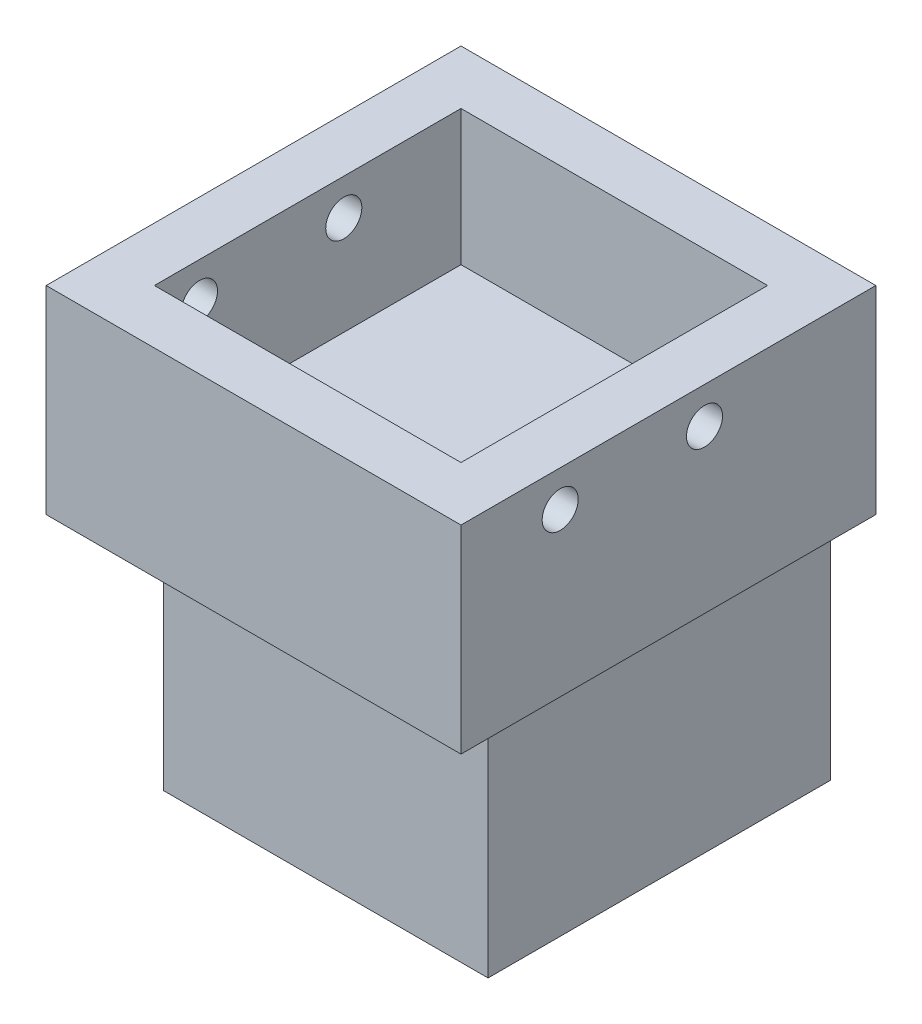
ISO-10303-21;
HEADER;
FILE_DESCRIPTION(('STEP AP214'),'2;1');
FILE_NAME('part.step','',(''),(''),'','','');
FILE_SCHEMA(('AUTOMOTIVE_DESIGN { 1 0 10303 214 1 1 1 1 }'));
ENDSEC;
DATA;
#1=APPLICATION_CONTEXT('core data for automotive mechanical design processes');
#2=APPLICATION_PROTOCOL_DEFINITION('international standard','automotive_design',2000,#1);
#3=PRODUCT_CONTEXT('',#1,'mechanical');
#4=PRODUCT('Part','Part','',(#3));
#5=PRODUCT_RELATED_PRODUCT_CATEGORY('part','',(#4));
#6=PRODUCT_DEFINITION_FORMATION('','',#4);
#7=PRODUCT_DEFINITION_CONTEXT('part definition',#1,'design');
#8=PRODUCT_DEFINITION('design','',#6,#7);
#9=PRODUCT_DEFINITION_SHAPE('','',#8);
#10=(LENGTH_UNIT() NAMED_UNIT(*) SI_UNIT(.MILLI.,.METRE.));
#11=(NAMED_UNIT(*) PLANE_ANGLE_UNIT() SI_UNIT($,.RADIAN.));
#12=(NAMED_UNIT(*) SI_UNIT($,.STERADIAN.) SOLID_ANGLE_UNIT());
#13=UNCERTAINTY_MEASURE_WITH_UNIT(LENGTH_MEASURE(1.E-05),#10,'distance_accuracy_value','');
#14=(GEOMETRIC_REPRESENTATION_CONTEXT(3) GLOBAL_UNCERTAINTY_ASSIGNED_CONTEXT((#13)) GLOBAL_UNIT_ASSIGNED_CONTEXT((#10,
#11,#12)) REPRESENTATION_CONTEXT('',''));
#15=CARTESIAN_POINT('',(0.,0.,0.));
#16=DIRECTION('',(0.,0.,1.));
#17=DIRECTION('',(1.,0.,0.));
#18=AXIS2_PLACEMENT_3D('',#15,#16,#17);
#19=CARTESIAN_POINT('',(0.,-11.,0.));
#20=DIRECTION('',(0.,1.,0.));
#21=DIRECTION('',(0.,0.,1.));
#22=AXIS2_PLACEMENT_3D('',#19,#20,#21);
#23=PLANE('',#22);
#24=DIRECTION('',(0.,0.,-1.));
#25=VECTOR('',#24,1.);
#26=CARTESIAN_POINT('',(1.33174603174603,-11.,-0.901746031746032));
#27=LINE('',#26,#25);
#28=CARTESIAN_POINT('',(1.33174603174603,-11.,18.098253968254));
#29=VERTEX_POINT('',#28);
#30=CARTESIAN_POINT('',(1.33174603174603,-11.,-0.901746031746032));
#31=VERTEX_POINT('',#30);
#32=EDGE_CURVE('E50',#29,#31,#27,.T.);
#33=ORIENTED_EDGE('',*,*,#32,.F.);
#34=DIRECTION('',(-1.,0.,0.));
#35=VECTOR('',#34,1.);
#36=CARTESIAN_POINT('',(1.33174603174603,-11.,18.098253968254));
#37=LINE('',#36,#35);
#38=CARTESIAN_POINT('',(19.331746031746,-11.,18.098253968254));
#39=VERTEX_POINT('',#38);
#40=EDGE_CURVE('E142',#39,#29,#37,.T.);
#41=ORIENTED_EDGE('',*,*,#40,.F.);
#42=DIRECTION('',(0.,0.,1.));
#43=VECTOR('',#42,1.);
#44=CARTESIAN_POINT('',(19.331746031746,-11.,-0.901746031746032));
#45=LINE('',#44,#43);
#46=CARTESIAN_POINT('',(19.331746031746,-11.,-0.901746031746032));
#47=VERTEX_POINT('',#46);
#48=EDGE_CURVE('E238',#47,#39,#45,.T.);
#49=ORIENTED_EDGE('',*,*,#48,.F.);
#50=DIRECTION('',(-1.,0.,0.));
#51=VECTOR('',#50,1.);
#52=CARTESIAN_POINT('',(-1.16825396825397,-11.,-0.901746031746032));
#53=LINE('',#52,#51);
#54=CARTESIAN_POINT('',(21.831746031746,-11.,-0.901746031746032));
#55=VERTEX_POINT('',#54);
#56=EDGE_CURVE('E193',#55,#47,#53,.T.);
#57=ORIENTED_EDGE('',*,*,#56,.F.);
#58=DIRECTION('',(0.,0.,-1.));
#59=VECTOR('',#58,1.);
#60=CARTESIAN_POINT('',(21.831746031746,-11.,-0.901746031746032));
#61=LINE('',#60,#59);
#62=CARTESIAN_POINT('',(21.831746031746,-11.,22.098253968254));
#63=VERTEX_POINT('',#62);
#64=EDGE_CURVE('E190',#63,#55,#61,.T.);
#65=ORIENTED_EDGE('',*,*,#64,.F.);
#66=DIRECTION('',(1.,0.,0.));
#67=VECTOR('',#66,1.);
#68=CARTESIAN_POINT('',(-1.16825396825397,-11.,22.098253968254));
#69=LINE('',#68,#67);
#70=CARTESIAN_POINT('',(-1.16825396825397,-11.,22.098253968254));
#71=VERTEX_POINT('',#70);
#72=EDGE_CURVE('E186',#71,#63,#69,.T.);
#73=ORIENTED_EDGE('',*,*,#72,.F.);
#74=DIRECTION('',(0.,0.,1.));
#75=VECTOR('',#74,1.);
#76=CARTESIAN_POINT('',(-1.16825396825397,-11.,-0.901746031746032));
#77=LINE('',#76,#75);
#78=CARTESIAN_POINT('',(-1.16825396825397,-11.,-0.901746031746032));
#79=VERTEX_POINT('',#78);
#80=EDGE_CURVE('E183',#79,#71,#77,.T.);
#81=ORIENTED_EDGE('',*,*,#80,.F.);
#82=EDGE_CURVE('E55',#31,#79,#53,.T.);
#83=ORIENTED_EDGE('',*,*,#82,.F.);
#84=EDGE_LOOP('',(#33,#41,#49,#57,#65,#73,#81,#83));
#85=FACE_BOUND('',#84,.T.);
#86=ADVANCED_FACE('F33',(#85),#23,.F.);
#87=CARTESIAN_POINT('',(-1.16825396825397,-11.,-0.901746031746032));
#88=DIRECTION('',(-1.,0.,0.));
#89=DIRECTION('',(0.,0.,1.));
#90=AXIS2_PLACEMENT_3D('',#87,#88,#89);
#91=PLANE('',#90);
#92=CARTESIAN_POINT('',(-1.16825396825397,-2.00693582496217,8.59825396825396));
#93=DIRECTION('',(-1.,0.,0.));
#94=DIRECTION('',(0.,0.,1.));
#95=AXIS2_PLACEMENT_3D('',#92,#93,#94);
#96=CIRCLE('',#95,1.);
#97=CARTESIAN_POINT('',(-1.16825396825397,-2.00693582496217,9.59825396825396));
#98=VERTEX_POINT('',#97);
#99=EDGE_CURVE('E218',#98,#98,#96,.T.);
#100=ORIENTED_EDGE('',*,*,#99,.F.);
#101=EDGE_LOOP('',(#100));
#102=FACE_BOUND('',#101,.T.);
#103=CARTESIAN_POINT('',(-1.16825396825397,-2.00693582496217,16.598253968254));
#104=DIRECTION('',(-1.,0.,0.));
#105=DIRECTION('',(0.,0.,1.));
#106=AXIS2_PLACEMENT_3D('',#103,#104,#105);
#107=CIRCLE('',#106,1.);
#108=CARTESIAN_POINT('',(-1.16825396825397,-2.00693582496217,17.598253968254));
#109=VERTEX_POINT('',#108);
#110=EDGE_CURVE('E228',#109,#109,#107,.T.);
#111=ORIENTED_EDGE('',*,*,#110,.F.);
#112=EDGE_LOOP('',(#111));
#113=FACE_BOUND('',#112,.T.);
#114=DIRECTION('',(0.,0.,1.));
#115=VECTOR('',#114,1.);
#116=CARTESIAN_POINT('',(-1.16825396825397,0.,-0.901746031746032));
#117=LINE('',#116,#115);
#118=CARTESIAN_POINT('',(-1.16825396825397,0.,-0.901746031746032));
#119=VERTEX_POINT('',#118);
#120=CARTESIAN_POINT('',(-1.16825396825397,0.,22.098253968254));
#121=VERTEX_POINT('',#120);
#122=EDGE_CURVE('E176',#119,#121,#117,.T.);
#123=ORIENTED_EDGE('',*,*,#122,.F.);
#124=DIRECTION('',(0.,1.,0.));
#125=VECTOR('',#124,1.);
#126=CARTESIAN_POINT('',(-1.16825396825397,-11.,-0.901746031746032));
#127=LINE('',#126,#125);
#128=EDGE_CURVE('E11',#79,#119,#127,.T.);
#129=ORIENTED_EDGE('',*,*,#128,.F.);
#130=ORIENTED_EDGE('',*,*,#80,.T.);
#131=DIRECTION('',(0.,1.,0.));
#132=VECTOR('',#131,1.);
#133=CARTESIAN_POINT('',(-1.16825396825397,-11.,22.098253968254));
#134=LINE('',#133,#132);
#135=EDGE_CURVE('E195',#71,#121,#134,.T.);
#136=ORIENTED_EDGE('',*,*,#135,.T.);
#137=EDGE_LOOP('',(#123,#129,#130,#136));
#138=FACE_BOUND('',#137,.T.);
#139=ADVANCED_FACE('F35',(#102,#113,#138),#91,.T.);
#140=CARTESIAN_POINT('',(-1.16825396825397,-11.,-0.901746031746032));
#141=DIRECTION('',(0.,0.,-1.));
#142=DIRECTION('',(-1.,0.,0.));
#143=AXIS2_PLACEMENT_3D('',#140,#141,#142);
#144=PLANE('',#143);
#145=DIRECTION('',(-1.,0.,0.));
#146=VECTOR('',#145,1.);
#147=CARTESIAN_POINT('',(-1.16825396825397,0.,-0.901746031746032));
#148=LINE('',#147,#146);
#149=CARTESIAN_POINT('',(21.831746031746,0.,-0.901746031746032));
#150=VERTEX_POINT('',#149);
#151=EDGE_CURVE('E187',#150,#119,#148,.T.);
#152=ORIENTED_EDGE('',*,*,#151,.F.);
#153=DIRECTION('',(0.,1.,0.));
#154=VECTOR('',#153,1.);
#155=CARTESIAN_POINT('',(21.831746031746,-11.,-0.901746031746032));
#156=LINE('',#155,#154);
#157=EDGE_CURVE('E42',#55,#150,#156,.T.);
#158=ORIENTED_EDGE('',*,*,#157,.F.);
#159=ORIENTED_EDGE('',*,*,#56,.T.);
#160=DIRECTION('',(0.,1.,0.));
#161=VECTOR('',#160,1.);
#162=CARTESIAN_POINT('',(19.331746031746,-25.,-0.901746031746032));
#163=LINE('',#162,#161);
#164=CARTESIAN_POINT('',(19.331746031746,-25.,-0.901746031746032));
#165=VERTEX_POINT('',#164);
#166=EDGE_CURVE('E129',#165,#47,#163,.T.);
#167=ORIENTED_EDGE('',*,*,#166,.F.);
#168=DIRECTION('',(1.,0.,0.));
#169=VECTOR('',#168,1.);
#170=CARTESIAN_POINT('',(1.33174603174603,-25.,-0.901746031746032));
#171=LINE('',#170,#169);
#172=CARTESIAN_POINT('',(1.33174603174603,-25.,-0.901746031746032));
#173=VERTEX_POINT('',#172);
#174=EDGE_CURVE('E121',#173,#165,#171,.T.);
#175=ORIENTED_EDGE('',*,*,#174,.F.);
#176=DIRECTION('',(0.,1.,0.));
#177=VECTOR('',#176,1.);
#178=CARTESIAN_POINT('',(1.33174603174603,-25.,-0.901746031746032));
#179=LINE('',#178,#177);
#180=EDGE_CURVE('E126',#173,#31,#179,.T.);
#181=ORIENTED_EDGE('',*,*,#180,.T.);
#182=ORIENTED_EDGE('',*,*,#82,.T.);
#183=ORIENTED_EDGE('',*,*,#128,.T.);
#184=EDGE_LOOP('',(#152,#158,#159,#167,#175,#181,#182,#183));
#185=FACE_BOUND('',#184,.T.);
#186=ADVANCED_FACE('F124',(#185),#144,.T.);
#187=CARTESIAN_POINT('',(21.831746031746,-11.,-0.901746031746032));
#188=DIRECTION('',(1.,0.,0.));
#189=DIRECTION('',(0.,0.,-1.));
#190=AXIS2_PLACEMENT_3D('',#187,#188,#189);
#191=PLANE('',#190);
#192=CARTESIAN_POINT('',(21.831746031746,-2.00693582496217,8.59825396825396));
#193=DIRECTION('',(-1.,0.,0.));
#194=DIRECTION('',(0.,0.,1.));
#195=AXIS2_PLACEMENT_3D('',#192,#193,#194);
#196=CIRCLE('',#195,1.);
#197=CARTESIAN_POINT('',(21.831746031746,-2.00693582496217,9.59825396825396));
#198=VERTEX_POINT('',#197);
#199=EDGE_CURVE('E212',#198,#198,#196,.T.);
#200=ORIENTED_EDGE('',*,*,#199,.T.);
#201=EDGE_LOOP('',(#200));
#202=FACE_BOUND('',#201,.T.);
#203=CARTESIAN_POINT('',(21.831746031746,-2.00693582496217,16.598253968254));
#204=DIRECTION('',(-1.,0.,0.));
#205=DIRECTION('',(0.,0.,1.));
#206=AXIS2_PLACEMENT_3D('',#203,#204,#205);
#207=CIRCLE('',#206,1.);
#208=CARTESIAN_POINT('',(21.831746031746,-2.00693582496217,17.598253968254));
#209=VERTEX_POINT('',#208);
#210=EDGE_CURVE('E223',#209,#209,#207,.T.);
#211=ORIENTED_EDGE('',*,*,#210,.T.);
#212=EDGE_LOOP('',(#211));
#213=FACE_BOUND('',#212,.T.);
#214=DIRECTION('',(0.,0.,-1.));
#215=VECTOR('',#214,1.);
#216=CARTESIAN_POINT('',(21.831746031746,0.,-0.901746031746032));
#217=LINE('',#216,#215);
#218=CARTESIAN_POINT('',(21.831746031746,0.,22.098253968254));
#219=VERTEX_POINT('',#218);
#220=EDGE_CURVE('E201',#219,#150,#217,.T.);
#221=ORIENTED_EDGE('',*,*,#220,.F.);
#222=DIRECTION('',(0.,1.,0.));
#223=VECTOR('',#222,1.);
#224=CARTESIAN_POINT('',(21.831746031746,-11.,22.098253968254));
#225=LINE('',#224,#223);
#226=EDGE_CURVE('E207',#63,#219,#225,.T.);
#227=ORIENTED_EDGE('',*,*,#226,.F.);
#228=ORIENTED_EDGE('',*,*,#64,.T.);
#229=ORIENTED_EDGE('',*,*,#157,.T.);
#230=EDGE_LOOP('',(#221,#227,#228,#229));
#231=FACE_BOUND('',#230,.T.);
#232=ADVANCED_FACE('F252',(#202,#213,#231),#191,.T.);
#233=CARTESIAN_POINT('',(-1.16825396825397,-11.,22.098253968254));
#234=DIRECTION('',(0.,0.,1.));
#235=DIRECTION('',(1.,0.,0.));
#236=AXIS2_PLACEMENT_3D('',#233,#234,#235);
#237=PLANE('',#236);
#238=DIRECTION('',(1.,0.,0.));
#239=VECTOR('',#238,1.);
#240=CARTESIAN_POINT('',(-1.16825396825397,0.,22.098253968254));
#241=LINE('',#240,#239);
#242=EDGE_CURVE('E198',#121,#219,#241,.T.);
#243=ORIENTED_EDGE('',*,*,#242,.F.);
#244=ORIENTED_EDGE('',*,*,#135,.F.);
#245=ORIENTED_EDGE('',*,*,#72,.T.);
#246=ORIENTED_EDGE('',*,*,#226,.T.);
#247=EDGE_LOOP('',(#243,#244,#245,#246));
#248=FACE_BOUND('',#247,.T.);
#249=ADVANCED_FACE('F256',(#248),#237,.T.);
#250=CARTESIAN_POINT('',(0.,0.,0.));
#251=DIRECTION('',(0.,1.,0.));
#252=DIRECTION('',(0.,0.,1.));
#253=AXIS2_PLACEMENT_3D('',#250,#251,#252);
#254=PLANE('',#253);
#255=DIRECTION('',(0.,0.,1.));
#256=VECTOR('',#255,1.);
#257=CARTESIAN_POINT('',(1.83174603174603,0.,2.09825396825397));
#258=LINE('',#257,#256);
#259=CARTESIAN_POINT('',(1.83174603174603,0.,2.09825396825397));
#260=VERTEX_POINT('',#259);
#261=CARTESIAN_POINT('',(1.83174603174603,0.,19.098253968254));
#262=VERTEX_POINT('',#261);
#263=EDGE_CURVE('E145',#260,#262,#258,.T.);
#264=ORIENTED_EDGE('',*,*,#263,.F.);
#265=DIRECTION('',(-1.,0.,0.));
#266=VECTOR('',#265,1.);
#267=CARTESIAN_POINT('',(1.83174603174603,0.,2.09825396825397));
#268=LINE('',#267,#266);
#269=CARTESIAN_POINT('',(18.831746031746,0.,2.09825396825397));
#270=VERTEX_POINT('',#269);
#271=EDGE_CURVE('E157',#270,#260,#268,.T.);
#272=ORIENTED_EDGE('',*,*,#271,.F.);
#273=DIRECTION('',(0.,0.,-1.));
#274=VECTOR('',#273,1.);
#275=CARTESIAN_POINT('',(18.831746031746,0.,2.09825396825397));
#276=LINE('',#275,#274);
#277=CARTESIAN_POINT('',(18.831746031746,0.,19.098253968254));
#278=VERTEX_POINT('',#277);
#279=EDGE_CURVE('E169',#278,#270,#276,.T.);
#280=ORIENTED_EDGE('',*,*,#279,.F.);
#281=DIRECTION('',(1.,0.,0.));
#282=VECTOR('',#281,1.);
#283=CARTESIAN_POINT('',(1.83174603174603,0.,19.098253968254));
#284=LINE('',#283,#282);
#285=EDGE_CURVE('E147',#262,#278,#284,.T.);
#286=ORIENTED_EDGE('',*,*,#285,.F.);
#287=EDGE_LOOP('',(#264,#272,#280,#286));
#288=FACE_BOUND('',#287,.T.);
#289=ORIENTED_EDGE('',*,*,#122,.T.);
#290=ORIENTED_EDGE('',*,*,#242,.T.);
#291=ORIENTED_EDGE('',*,*,#220,.T.);
#292=ORIENTED_EDGE('',*,*,#151,.T.);
#293=EDGE_LOOP('',(#289,#290,#291,#292));
#294=FACE_BOUND('',#293,.T.);
#295=ADVANCED_FACE('F261',(#288,#294),#254,.T.);
#296=CARTESIAN_POINT('',(1.83174603174603,-7.5,2.09825396825397));
#297=DIRECTION('',(-1.,0.,0.));
#298=DIRECTION('',(0.,0.,1.));
#299=AXIS2_PLACEMENT_3D('',#296,#297,#298);
#300=PLANE('',#299);
#301=CARTESIAN_POINT('',(1.83174603174603,-2.00693582496217,8.59825396825396));
#302=DIRECTION('',(-1.,0.,0.));
#303=DIRECTION('',(0.,0.,1.));
#304=AXIS2_PLACEMENT_3D('',#301,#302,#303);
#305=CIRCLE('',#304,1.);
#306=CARTESIAN_POINT('',(1.83174603174603,-2.00693582496217,9.59825396825396));
#307=VERTEX_POINT('',#306);
#308=EDGE_CURVE('E231',#307,#307,#305,.T.);
#309=ORIENTED_EDGE('',*,*,#308,.T.);
#310=EDGE_LOOP('',(#309));
#311=FACE_BOUND('',#310,.T.);
#312=CARTESIAN_POINT('',(1.83174603174604,-2.00693582496217,16.598253968254));
#313=DIRECTION('',(-1.,0.,0.));
#314=DIRECTION('',(0.,0.,1.));
#315=AXIS2_PLACEMENT_3D('',#312,#313,#314);
#316=CIRCLE('',#315,1.);
#317=CARTESIAN_POINT('',(1.83174603174604,-2.00693582496217,17.598253968254));
#318=VERTEX_POINT('',#317);
#319=EDGE_CURVE('E211',#318,#318,#316,.T.);
#320=ORIENTED_EDGE('',*,*,#319,.T.);
#321=EDGE_LOOP('',(#320));
#322=FACE_BOUND('',#321,.T.);
#323=ORIENTED_EDGE('',*,*,#263,.T.);
#324=DIRECTION('',(0.,1.,0.));
#325=VECTOR('',#324,1.);
#326=CARTESIAN_POINT('',(1.83174603174603,-7.5,19.098253968254));
#327=LINE('',#326,#325);
#328=CARTESIAN_POINT('',(1.83174603174603,-7.5,19.098253968254));
#329=VERTEX_POINT('',#328);
#330=EDGE_CURVE('E165',#329,#262,#327,.T.);
#331=ORIENTED_EDGE('',*,*,#330,.F.);
#332=DIRECTION('',(0.,0.,1.));
#333=VECTOR('',#332,1.);
#334=CARTESIAN_POINT('',(1.83174603174603,-7.5,2.09825396825397));
#335=LINE('',#334,#333);
#336=CARTESIAN_POINT('',(1.83174603174603,-7.5,2.09825396825397));
#337=VERTEX_POINT('',#336);
#338=EDGE_CURVE('E153',#337,#329,#335,.T.);
#339=ORIENTED_EDGE('',*,*,#338,.F.);
#340=DIRECTION('',(0.,1.,0.));
#341=VECTOR('',#340,1.);
#342=CARTESIAN_POINT('',(1.83174603174603,-7.5,2.09825396825397));
#343=LINE('',#342,#341);
#344=EDGE_CURVE('E174',#337,#260,#343,.T.);
#345=ORIENTED_EDGE('',*,*,#344,.T.);
#346=EDGE_LOOP('',(#323,#331,#339,#345));
#347=FACE_BOUND('',#346,.T.);
#348=ADVANCED_FACE('F263',(#311,#322,#347),#300,.F.);
#349=CARTESIAN_POINT('',(1.83174603174603,-7.5,2.09825396825397));
#350=DIRECTION('',(0.,0.,-1.));
#351=DIRECTION('',(-1.,0.,0.));
#352=AXIS2_PLACEMENT_3D('',#349,#350,#351);
#353=PLANE('',#352);
#354=ORIENTED_EDGE('',*,*,#271,.T.);
#355=ORIENTED_EDGE('',*,*,#344,.F.);
#356=DIRECTION('',(-1.,0.,0.));
#357=VECTOR('',#356,1.);
#358=CARTESIAN_POINT('',(1.83174603174603,-7.5,2.09825396825397));
#359=LINE('',#358,#357);
#360=CARTESIAN_POINT('',(18.831746031746,-7.5,2.09825396825397));
#361=VERTEX_POINT('',#360);
#362=EDGE_CURVE('E163',#361,#337,#359,.T.);
#363=ORIENTED_EDGE('',*,*,#362,.F.);
#364=DIRECTION('',(0.,1.,0.));
#365=VECTOR('',#364,1.);
#366=CARTESIAN_POINT('',(18.831746031746,-7.5,2.09825396825397));
#367=LINE('',#366,#365);
#368=EDGE_CURVE('E177',#361,#270,#367,.T.);
#369=ORIENTED_EDGE('',*,*,#368,.T.);
#370=EDGE_LOOP('',(#354,#355,#363,#369));
#371=FACE_BOUND('',#370,.T.);
#372=ADVANCED_FACE('F270',(#371),#353,.F.);
#373=CARTESIAN_POINT('',(18.831746031746,-7.5,2.09825396825397));
#374=DIRECTION('',(1.,0.,0.));
#375=DIRECTION('',(0.,0.,-1.));
#376=AXIS2_PLACEMENT_3D('',#373,#374,#375);
#377=PLANE('',#376);
#378=CARTESIAN_POINT('',(18.831746031746,-2.00693582496217,8.59825396825396));
#379=DIRECTION('',(1.,0.,0.));
#380=DIRECTION('',(0.,0.,-1.));
#381=AXIS2_PLACEMENT_3D('',#378,#379,#380);
#382=CIRCLE('',#381,1.);
#383=CARTESIAN_POINT('',(18.831746031746,-2.00693582496217,7.59825396825396));
#384=VERTEX_POINT('',#383);
#385=EDGE_CURVE('E37',#384,#384,#382,.T.);
#386=ORIENTED_EDGE('',*,*,#385,.T.);
#387=EDGE_LOOP('',(#386));
#388=FACE_BOUND('',#387,.T.);
#389=CARTESIAN_POINT('',(18.831746031746,-2.00693582496217,16.598253968254));
#390=DIRECTION('',(1.,0.,0.));
#391=DIRECTION('',(0.,0.,-1.));
#392=AXIS2_PLACEMENT_3D('',#389,#390,#391);
#393=CIRCLE('',#392,1.);
#394=CARTESIAN_POINT('',(18.831746031746,-2.00693582496217,15.598253968254));
#395=VERTEX_POINT('',#394);
#396=EDGE_CURVE('E209',#395,#395,#393,.T.);
#397=ORIENTED_EDGE('',*,*,#396,.T.);
#398=EDGE_LOOP('',(#397));
#399=FACE_BOUND('',#398,.T.);
#400=ORIENTED_EDGE('',*,*,#279,.T.);
#401=ORIENTED_EDGE('',*,*,#368,.F.);
#402=DIRECTION('',(0.,0.,-1.));
#403=VECTOR('',#402,1.);
#404=CARTESIAN_POINT('',(18.831746031746,-7.5,2.09825396825397));
#405=LINE('',#404,#403);
#406=CARTESIAN_POINT('',(18.831746031746,-7.5,19.098253968254));
#407=VERTEX_POINT('',#406);
#408=EDGE_CURVE('E160',#407,#361,#405,.T.);
#409=ORIENTED_EDGE('',*,*,#408,.F.);
#410=DIRECTION('',(0.,1.,0.));
#411=VECTOR('',#410,1.);
#412=CARTESIAN_POINT('',(18.831746031746,-7.5,19.098253968254));
#413=LINE('',#412,#411);
#414=EDGE_CURVE('E179',#407,#278,#413,.T.);
#415=ORIENTED_EDGE('',*,*,#414,.T.);
#416=EDGE_LOOP('',(#400,#401,#409,#415));
#417=FACE_BOUND('',#416,.T.);
#418=ADVANCED_FACE('F286',(#388,#399,#417),#377,.F.);
#419=CARTESIAN_POINT('',(1.83174603174603,-7.5,19.098253968254));
#420=DIRECTION('',(0.,0.,1.));
#421=DIRECTION('',(1.,0.,0.));
#422=AXIS2_PLACEMENT_3D('',#419,#420,#421);
#423=PLANE('',#422);
#424=ORIENTED_EDGE('',*,*,#285,.T.);
#425=ORIENTED_EDGE('',*,*,#414,.F.);
#426=DIRECTION('',(1.,0.,0.));
#427=VECTOR('',#426,1.);
#428=CARTESIAN_POINT('',(1.83174603174603,-7.5,19.098253968254));
#429=LINE('',#428,#427);
#430=EDGE_CURVE('E156',#329,#407,#429,.T.);
#431=ORIENTED_EDGE('',*,*,#430,.F.);
#432=ORIENTED_EDGE('',*,*,#330,.T.);
#433=EDGE_LOOP('',(#424,#425,#431,#432));
#434=FACE_BOUND('',#433,.T.);
#435=ADVANCED_FACE('F282',(#434),#423,.F.);
#436=CARTESIAN_POINT('',(0.,-7.5,0.));
#437=DIRECTION('',(0.,1.,0.));
#438=DIRECTION('',(0.,0.,1.));
#439=AXIS2_PLACEMENT_3D('',#436,#437,#438);
#440=PLANE('',#439);
#441=ORIENTED_EDGE('',*,*,#338,.T.);
#442=ORIENTED_EDGE('',*,*,#430,.T.);
#443=ORIENTED_EDGE('',*,*,#408,.T.);
#444=ORIENTED_EDGE('',*,*,#362,.T.);
#445=EDGE_LOOP('',(#441,#442,#443,#444));
#446=FACE_BOUND('',#445,.T.);
#447=ADVANCED_FACE('F285',(#446),#440,.T.);
#448=CARTESIAN_POINT('',(1.33174603174603,-25.,-0.901746031746032));
#449=DIRECTION('',(1.,0.,0.));
#450=DIRECTION('',(0.,0.,-1.));
#451=AXIS2_PLACEMENT_3D('',#448,#449,#450);
#452=PLANE('',#451);
#453=ORIENTED_EDGE('',*,*,#32,.T.);
#454=ORIENTED_EDGE('',*,*,#180,.F.);
#455=DIRECTION('',(0.,0.,-1.));
#456=VECTOR('',#455,1.);
#457=CARTESIAN_POINT('',(1.33174603174603,-25.,-0.901746031746032));
#458=LINE('',#457,#456);
#459=CARTESIAN_POINT('',(1.33174603174603,-25.,18.098253968254));
#460=VERTEX_POINT('',#459);
#461=EDGE_CURVE('E133',#460,#173,#458,.T.);
#462=ORIENTED_EDGE('',*,*,#461,.F.);
#463=DIRECTION('',(0.,1.,0.));
#464=VECTOR('',#463,1.);
#465=CARTESIAN_POINT('',(1.33174603174603,-25.,18.098253968254));
#466=LINE('',#465,#464);
#467=EDGE_CURVE('E236',#460,#29,#466,.T.);
#468=ORIENTED_EDGE('',*,*,#467,.T.);
#469=EDGE_LOOP('',(#453,#454,#462,#468));
#470=FACE_BOUND('',#469,.T.);
#471=ADVANCED_FACE('F144',(#470),#452,.F.);
#472=CARTESIAN_POINT('',(19.331746031746,-25.,-0.901746031746032));
#473=DIRECTION('',(-1.,0.,0.));
#474=DIRECTION('',(0.,0.,1.));
#475=AXIS2_PLACEMENT_3D('',#472,#473,#474);
#476=PLANE('',#475);
#477=ORIENTED_EDGE('',*,*,#48,.T.);
#478=DIRECTION('',(0.,1.,0.));
#479=VECTOR('',#478,1.);
#480=CARTESIAN_POINT('',(19.331746031746,-25.,18.098253968254));
#481=LINE('',#480,#479);
#482=CARTESIAN_POINT('',(19.331746031746,-25.,18.098253968254));
#483=VERTEX_POINT('',#482);
#484=EDGE_CURVE('E149',#483,#39,#481,.T.);
#485=ORIENTED_EDGE('',*,*,#484,.F.);
#486=DIRECTION('',(0.,0.,1.));
#487=VECTOR('',#486,1.);
#488=CARTESIAN_POINT('',(19.331746031746,-25.,-0.901746031746032));
#489=LINE('',#488,#487);
#490=EDGE_CURVE('E132',#165,#483,#489,.T.);
#491=ORIENTED_EDGE('',*,*,#490,.F.);
#492=ORIENTED_EDGE('',*,*,#166,.T.);
#493=EDGE_LOOP('',(#477,#485,#491,#492));
#494=FACE_BOUND('',#493,.T.);
#495=ADVANCED_FACE('F247',(#494),#476,.F.);
#496=CARTESIAN_POINT('',(1.33174603174603,-25.,18.098253968254));
#497=DIRECTION('',(0.,0.,-1.));
#498=DIRECTION('',(-1.,0.,0.));
#499=AXIS2_PLACEMENT_3D('',#496,#497,#498);
#500=PLANE('',#499);
#501=ORIENTED_EDGE('',*,*,#40,.T.);
#502=ORIENTED_EDGE('',*,*,#467,.F.);
#503=DIRECTION('',(-1.,0.,0.));
#504=VECTOR('',#503,1.);
#505=CARTESIAN_POINT('',(1.33174603174603,-25.,18.098253968254));
#506=LINE('',#505,#504);
#507=EDGE_CURVE('E138',#483,#460,#506,.T.);
#508=ORIENTED_EDGE('',*,*,#507,.F.);
#509=ORIENTED_EDGE('',*,*,#484,.T.);
#510=EDGE_LOOP('',(#501,#502,#508,#509));
#511=FACE_BOUND('',#510,.T.);
#512=ADVANCED_FACE('F245',(#511),#500,.F.);
#513=CARTESIAN_POINT('',(0.,-25.,0.));
#514=DIRECTION('',(0.,1.,0.));
#515=DIRECTION('',(0.,0.,1.));
#516=AXIS2_PLACEMENT_3D('',#513,#514,#515);
#517=PLANE('',#516);
#518=ORIENTED_EDGE('',*,*,#461,.T.);
#519=ORIENTED_EDGE('',*,*,#174,.T.);
#520=ORIENTED_EDGE('',*,*,#490,.T.);
#521=ORIENTED_EDGE('',*,*,#507,.T.);
#522=EDGE_LOOP('',(#518,#519,#520,#521));
#523=FACE_BOUND('',#522,.T.);
#524=ADVANCED_FACE('F136',(#523),#517,.F.);
#525=CARTESIAN_POINT('',(21.831746031746,-2.00693582496217,16.598253968254));
#526=DIRECTION('',(-1.,0.,0.));
#527=DIRECTION('',(0.,0.,1.));
#528=AXIS2_PLACEMENT_3D('',#525,#526,#527);
#529=CYLINDRICAL_SURFACE('',#528,1.);
#530=ORIENTED_EDGE('',*,*,#210,.F.);
#531=EDGE_LOOP('',(#530));
#532=FACE_BOUND('',#531,.T.);
#533=ORIENTED_EDGE('',*,*,#396,.F.);
#534=EDGE_LOOP('',(#533));
#535=FACE_BOUND('',#534,.T.);
#536=ADVANCED_FACE('F305',(#532,#535),#529,.F.);
#537=CARTESIAN_POINT('',(21.831746031746,-2.00693582496217,8.59825396825396));
#538=DIRECTION('',(-1.,0.,0.));
#539=DIRECTION('',(0.,0.,1.));
#540=AXIS2_PLACEMENT_3D('',#537,#538,#539);
#541=CYLINDRICAL_SURFACE('',#540,1.);
#542=ORIENTED_EDGE('',*,*,#199,.F.);
#543=EDGE_LOOP('',(#542));
#544=FACE_BOUND('',#543,.T.);
#545=ORIENTED_EDGE('',*,*,#385,.F.);
#546=EDGE_LOOP('',(#545));
#547=FACE_BOUND('',#546,.T.);
#548=ADVANCED_FACE('F310',(#544,#547),#541,.F.);
#549=ORIENTED_EDGE('',*,*,#110,.T.);
#550=EDGE_LOOP('',(#549));
#551=FACE_BOUND('',#550,.T.);
#552=ORIENTED_EDGE('',*,*,#319,.F.);
#553=EDGE_LOOP('',(#552));
#554=FACE_BOUND('',#553,.T.);
#555=ADVANCED_FACE('F306',(#551,#554),#529,.F.);
#556=ORIENTED_EDGE('',*,*,#99,.T.);
#557=EDGE_LOOP('',(#556));
#558=FACE_BOUND('',#557,.T.);
#559=ORIENTED_EDGE('',*,*,#308,.F.);
#560=EDGE_LOOP('',(#559));
#561=FACE_BOUND('',#560,.T.);
#562=ADVANCED_FACE('F309',(#558,#561),#541,.F.);
#563=CLOSED_SHELL('',(#86,#139,#186,#232,#249,#295,#348,#372,#418,#435,#447,#471,#495,#512,#524,
#536,#548,#555,#562));
#564=MANIFOLD_SOLID_BREP('B2',#563);
#565=ADVANCED_BREP_SHAPE_REPRESENTATION('',(#18,#564),#14);
#566=SHAPE_DEFINITION_REPRESENTATION(#9,#565);
ENDSEC;
END-ISO-10303-21;
